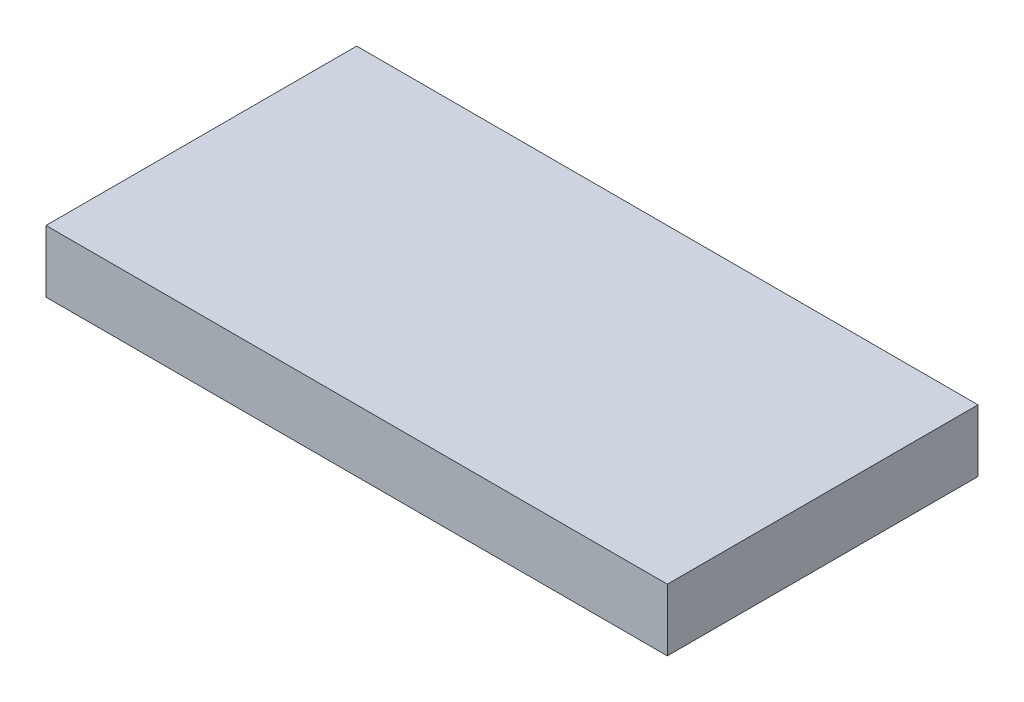
ISO-10303-21;
HEADER;
FILE_DESCRIPTION(('STEP AP214'),'2;1');
FILE_NAME('part.step','',(''),(''),'','','');
FILE_SCHEMA(('AUTOMOTIVE_DESIGN { 1 0 10303 214 1 1 1 1 }'));
ENDSEC;
DATA;
#1=APPLICATION_CONTEXT('core data for automotive mechanical design processes');
#2=APPLICATION_PROTOCOL_DEFINITION('international standard','automotive_design',2000,#1);
#3=PRODUCT_CONTEXT('',#1,'mechanical');
#4=PRODUCT('Part','Part','',(#3));
#5=PRODUCT_RELATED_PRODUCT_CATEGORY('part','',(#4));
#6=PRODUCT_DEFINITION_FORMATION('','',#4);
#7=PRODUCT_DEFINITION_CONTEXT('part definition',#1,'design');
#8=PRODUCT_DEFINITION('design','',#6,#7);
#9=PRODUCT_DEFINITION_SHAPE('','',#8);
#10=(LENGTH_UNIT() NAMED_UNIT(*) SI_UNIT(.MILLI.,.METRE.));
#11=(NAMED_UNIT(*) PLANE_ANGLE_UNIT() SI_UNIT($,.RADIAN.));
#12=(NAMED_UNIT(*) SI_UNIT($,.STERADIAN.) SOLID_ANGLE_UNIT());
#13=UNCERTAINTY_MEASURE_WITH_UNIT(LENGTH_MEASURE(1.E-05),#10,'distance_accuracy_value','');
#14=(GEOMETRIC_REPRESENTATION_CONTEXT(3) GLOBAL_UNCERTAINTY_ASSIGNED_CONTEXT((#13)) GLOBAL_UNIT_ASSIGNED_CONTEXT((#10,
#11,#12)) REPRESENTATION_CONTEXT('',''));
#15=CARTESIAN_POINT('',(0.,0.,0.));
#16=DIRECTION('',(0.,0.,1.));
#17=DIRECTION('',(1.,0.,0.));
#18=AXIS2_PLACEMENT_3D('',#15,#16,#17);
#19=CARTESIAN_POINT('',(0.,-4.,0.));
#20=DIRECTION('',(-1.,0.,0.));
#21=DIRECTION('',(0.,0.,1.));
#22=AXIS2_PLACEMENT_3D('',#19,#20,#21);
#23=PLANE('',#22);
#24=DIRECTION('',(0.,0.,1.));
#25=VECTOR('',#24,1.);
#26=CARTESIAN_POINT('',(0.,0.,0.));
#27=LINE('',#26,#25);
#28=CARTESIAN_POINT('',(0.,0.,-20.));
#29=VERTEX_POINT('',#28);
#30=CARTESIAN_POINT('',(0.,0.,0.));
#31=VERTEX_POINT('',#30);
#32=EDGE_CURVE('E104',#29,#31,#27,.T.);
#33=ORIENTED_EDGE('',*,*,#32,.F.);
#34=DIRECTION('',(0.,1.,0.));
#35=VECTOR('',#34,1.);
#36=CARTESIAN_POINT('',(0.,-4.,-20.));
#37=LINE('',#36,#35);
#38=CARTESIAN_POINT('',(0.,-4.,-20.));
#39=VERTEX_POINT('',#38);
#40=EDGE_CURVE('E11',#39,#29,#37,.T.);
#41=ORIENTED_EDGE('',*,*,#40,.F.);
#42=DIRECTION('',(0.,0.,1.));
#43=VECTOR('',#42,1.);
#44=CARTESIAN_POINT('',(0.,-4.,0.));
#45=LINE('',#44,#43);
#46=CARTESIAN_POINT('',(0.,-4.,0.));
#47=VERTEX_POINT('',#46);
#48=EDGE_CURVE('E100',#39,#47,#45,.T.);
#49=ORIENTED_EDGE('',*,*,#48,.T.);
#50=DIRECTION('',(0.,1.,0.));
#51=VECTOR('',#50,1.);
#52=CARTESIAN_POINT('',(0.,-4.,0.));
#53=LINE('',#52,#51);
#54=EDGE_CURVE('E45',#47,#31,#53,.T.);
#55=ORIENTED_EDGE('',*,*,#54,.T.);
#56=EDGE_LOOP('',(#33,#41,#49,#55));
#57=FACE_BOUND('',#56,.T.);
#58=ADVANCED_FACE('F39',(#57),#23,.T.);
#59=CARTESIAN_POINT('',(0.,-4.,-20.));
#60=DIRECTION('',(0.,0.,-1.));
#61=DIRECTION('',(-1.,0.,0.));
#62=AXIS2_PLACEMENT_3D('',#59,#60,#61);
#63=PLANE('',#62);
#64=DIRECTION('',(-1.,0.,0.));
#65=VECTOR('',#64,1.);
#66=CARTESIAN_POINT('',(0.,0.,-20.));
#67=LINE('',#66,#65);
#68=CARTESIAN_POINT('',(40.,0.,-20.));
#69=VERTEX_POINT('',#68);
#70=EDGE_CURVE('E98',#69,#29,#67,.T.);
#71=ORIENTED_EDGE('',*,*,#70,.F.);
#72=DIRECTION('',(0.,1.,0.));
#73=VECTOR('',#72,1.);
#74=CARTESIAN_POINT('',(40.,-4.,-20.));
#75=LINE('',#74,#73);
#76=CARTESIAN_POINT('',(40.,-4.,-20.));
#77=VERTEX_POINT('',#76);
#78=EDGE_CURVE('E48',#77,#69,#75,.T.);
#79=ORIENTED_EDGE('',*,*,#78,.F.);
#80=DIRECTION('',(-1.,0.,0.));
#81=VECTOR('',#80,1.);
#82=CARTESIAN_POINT('',(0.,-4.,-20.));
#83=LINE('',#82,#81);
#84=EDGE_CURVE('E92',#77,#39,#83,.T.);
#85=ORIENTED_EDGE('',*,*,#84,.T.);
#86=ORIENTED_EDGE('',*,*,#40,.T.);
#87=EDGE_LOOP('',(#71,#79,#85,#86));
#88=FACE_BOUND('',#87,.T.);
#89=ADVANCED_FACE('F111',(#88),#63,.T.);
#90=CARTESIAN_POINT('',(40.,-4.,0.));
#91=DIRECTION('',(1.,0.,0.));
#92=DIRECTION('',(0.,0.,-1.));
#93=AXIS2_PLACEMENT_3D('',#90,#91,#92);
#94=PLANE('',#93);
#95=DIRECTION('',(0.,0.,-1.));
#96=VECTOR('',#95,1.);
#97=CARTESIAN_POINT('',(40.,0.,0.));
#98=LINE('',#97,#96);
#99=CARTESIAN_POINT('',(40.,0.,0.));
#100=VERTEX_POINT('',#99);
#101=EDGE_CURVE('E87',#100,#69,#98,.T.);
#102=ORIENTED_EDGE('',*,*,#101,.F.);
#103=DIRECTION('',(0.,1.,0.));
#104=VECTOR('',#103,1.);
#105=CARTESIAN_POINT('',(40.,-4.,0.));
#106=LINE('',#105,#104);
#107=CARTESIAN_POINT('',(40.,-4.,0.));
#108=VERTEX_POINT('',#107);
#109=EDGE_CURVE('E84',#108,#100,#106,.T.);
#110=ORIENTED_EDGE('',*,*,#109,.F.);
#111=DIRECTION('',(0.,0.,-1.));
#112=VECTOR('',#111,1.);
#113=CARTESIAN_POINT('',(40.,-4.,0.));
#114=LINE('',#113,#112);
#115=EDGE_CURVE('E90',#108,#77,#114,.T.);
#116=ORIENTED_EDGE('',*,*,#115,.T.);
#117=ORIENTED_EDGE('',*,*,#78,.T.);
#118=EDGE_LOOP('',(#102,#110,#116,#117));
#119=FACE_BOUND('',#118,.T.);
#120=ADVANCED_FACE('F86',(#119),#94,.T.);
#121=CARTESIAN_POINT('',(0.,-4.,0.));
#122=DIRECTION('',(0.,0.,1.));
#123=DIRECTION('',(1.,0.,0.));
#124=AXIS2_PLACEMENT_3D('',#121,#122,#123);
#125=PLANE('',#124);
#126=DIRECTION('',(1.,0.,0.));
#127=VECTOR('',#126,1.);
#128=CARTESIAN_POINT('',(0.,0.,0.));
#129=LINE('',#128,#127);
#130=EDGE_CURVE('E106',#31,#100,#129,.T.);
#131=ORIENTED_EDGE('',*,*,#130,.F.);
#132=ORIENTED_EDGE('',*,*,#54,.F.);
#133=DIRECTION('',(1.,0.,0.));
#134=VECTOR('',#133,1.);
#135=CARTESIAN_POINT('',(0.,-4.,0.));
#136=LINE('',#135,#134);
#137=EDGE_CURVE('E93',#47,#108,#136,.T.);
#138=ORIENTED_EDGE('',*,*,#137,.T.);
#139=ORIENTED_EDGE('',*,*,#109,.T.);
#140=EDGE_LOOP('',(#131,#132,#138,#139));
#141=FACE_BOUND('',#140,.T.);
#142=ADVANCED_FACE('F96',(#141),#125,.T.);
#143=CARTESIAN_POINT('',(0.,-4.,0.));
#144=DIRECTION('',(0.,-1.,0.));
#145=DIRECTION('',(0.,0.,-1.));
#146=AXIS2_PLACEMENT_3D('',#143,#144,#145);
#147=PLANE('',#146);
#148=ORIENTED_EDGE('',*,*,#48,.F.);
#149=ORIENTED_EDGE('',*,*,#84,.F.);
#150=ORIENTED_EDGE('',*,*,#115,.F.);
#151=ORIENTED_EDGE('',*,*,#137,.F.);
#152=EDGE_LOOP('',(#148,#149,#150,#151));
#153=FACE_BOUND('',#152,.T.);
#154=ADVANCED_FACE('F95',(#153),#147,.T.);
#155=CARTESIAN_POINT('',(0.,0.,0.));
#156=DIRECTION('',(0.,-1.,0.));
#157=DIRECTION('',(0.,0.,-1.));
#158=AXIS2_PLACEMENT_3D('',#155,#156,#157);
#159=PLANE('',#158);
#160=ORIENTED_EDGE('',*,*,#32,.T.);
#161=ORIENTED_EDGE('',*,*,#130,.T.);
#162=ORIENTED_EDGE('',*,*,#101,.T.);
#163=ORIENTED_EDGE('',*,*,#70,.T.);
#164=EDGE_LOOP('',(#160,#161,#162,#163));
#165=FACE_BOUND('',#164,.T.);
#166=ADVANCED_FACE('F115',(#165),#159,.F.);
#167=CLOSED_SHELL('',(#58,#89,#120,#142,#154,#166));
#168=MANIFOLD_SOLID_BREP('B2',#167);
#169=ADVANCED_BREP_SHAPE_REPRESENTATION('',(#18,#168),#14);
#170=SHAPE_DEFINITION_REPRESENTATION(#9,#169);
ENDSEC;
END-ISO-10303-21;
